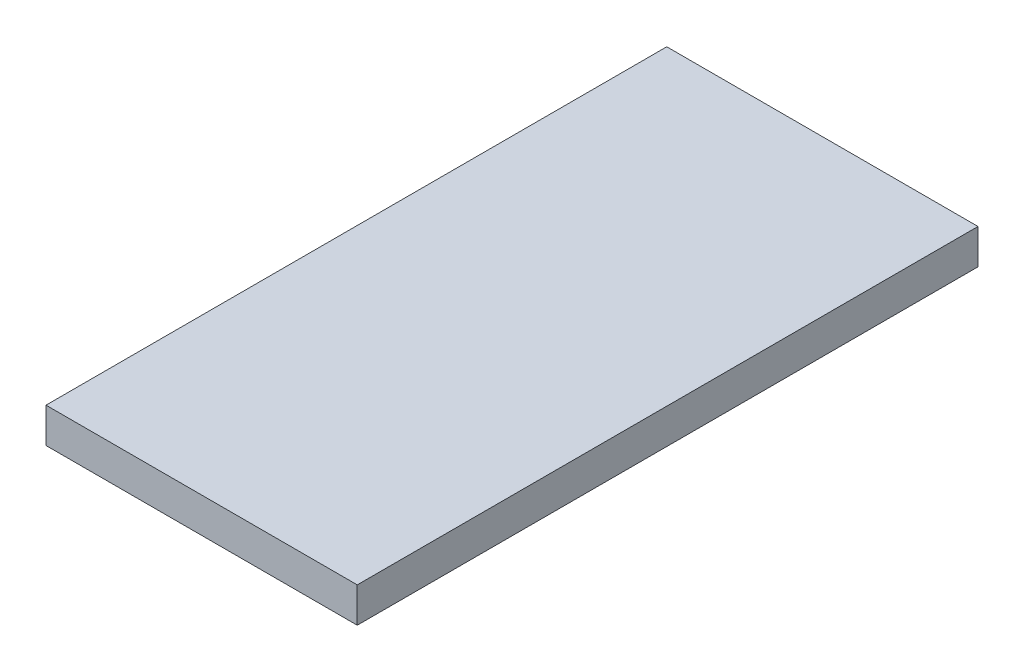
ISO-10303-21;
HEADER;
FILE_DESCRIPTION(('STEP AP214'),'2;1');
FILE_NAME('part.step','',(''),(''),'','','');
FILE_SCHEMA(('AUTOMOTIVE_DESIGN { 1 0 10303 214 1 1 1 1 }'));
ENDSEC;
DATA;
#1=APPLICATION_CONTEXT('core data for automotive mechanical design processes');
#2=APPLICATION_PROTOCOL_DEFINITION('international standard','automotive_design',2000,#1);
#3=PRODUCT_CONTEXT('',#1,'mechanical');
#4=PRODUCT('Part','Part','',(#3));
#5=PRODUCT_RELATED_PRODUCT_CATEGORY('part','',(#4));
#6=PRODUCT_DEFINITION_FORMATION('','',#4);
#7=PRODUCT_DEFINITION_CONTEXT('part definition',#1,'design');
#8=PRODUCT_DEFINITION('design','',#6,#7);
#9=PRODUCT_DEFINITION_SHAPE('','',#8);
#10=(LENGTH_UNIT() NAMED_UNIT(*) SI_UNIT(.MILLI.,.METRE.));
#11=(NAMED_UNIT(*) PLANE_ANGLE_UNIT() SI_UNIT($,.RADIAN.));
#12=(NAMED_UNIT(*) SI_UNIT($,.STERADIAN.) SOLID_ANGLE_UNIT());
#13=UNCERTAINTY_MEASURE_WITH_UNIT(LENGTH_MEASURE(1.E-05),#10,'distance_accuracy_value','');
#14=(GEOMETRIC_REPRESENTATION_CONTEXT(3) GLOBAL_UNCERTAINTY_ASSIGNED_CONTEXT((#13)) GLOBAL_UNIT_ASSIGNED_CONTEXT((#10,
#11,#12)) REPRESENTATION_CONTEXT('',''));
#15=CARTESIAN_POINT('',(0.,0.,0.));
#16=DIRECTION('',(0.,0.,1.));
#17=DIRECTION('',(1.,0.,0.));
#18=AXIS2_PLACEMENT_3D('',#15,#16,#17);
#19=CARTESIAN_POINT('',(8.9,2.,-17.75));
#20=DIRECTION('',(-1.,0.,0.));
#21=DIRECTION('',(0.,0.,1.));
#22=AXIS2_PLACEMENT_3D('',#19,#20,#21);
#23=PLANE('',#22);
#24=DIRECTION('',(0.,0.,-1.));
#25=VECTOR('',#24,1.);
#26=CARTESIAN_POINT('',(8.9,0.,-17.75));
#27=LINE('',#26,#25);
#28=CARTESIAN_POINT('',(8.9,0.,17.75));
#29=VERTEX_POINT('',#28);
#30=CARTESIAN_POINT('',(8.9,0.,-17.75));
#31=VERTEX_POINT('',#30);
#32=EDGE_CURVE('E113',#29,#31,#27,.T.);
#33=ORIENTED_EDGE('',*,*,#32,.T.);
#34=DIRECTION('',(0.,-1.,0.));
#35=VECTOR('',#34,1.);
#36=CARTESIAN_POINT('',(8.9,2.,-17.75));
#37=LINE('',#36,#35);
#38=CARTESIAN_POINT('',(8.9,2.,-17.75));
#39=VERTEX_POINT('',#38);
#40=EDGE_CURVE('E11',#39,#31,#37,.T.);
#41=ORIENTED_EDGE('',*,*,#40,.F.);
#42=DIRECTION('',(0.,0.,-1.));
#43=VECTOR('',#42,1.);
#44=CARTESIAN_POINT('',(8.9,2.,-17.75));
#45=LINE('',#44,#43);
#46=CARTESIAN_POINT('',(8.9,2.,17.75));
#47=VERTEX_POINT('',#46);
#48=EDGE_CURVE('E97',#47,#39,#45,.T.);
#49=ORIENTED_EDGE('',*,*,#48,.F.);
#50=DIRECTION('',(0.,-1.,0.));
#51=VECTOR('',#50,1.);
#52=CARTESIAN_POINT('',(8.9,2.,17.75));
#53=LINE('',#52,#51);
#54=EDGE_CURVE('E109',#47,#29,#53,.T.);
#55=ORIENTED_EDGE('',*,*,#54,.T.);
#56=EDGE_LOOP('',(#33,#41,#49,#55));
#57=FACE_BOUND('',#56,.T.);
#58=ADVANCED_FACE('F45',(#57),#23,.F.);
#59=CARTESIAN_POINT('',(-8.90000000000001,2.,-17.75));
#60=DIRECTION('',(0.,0.,1.));
#61=DIRECTION('',(1.,0.,0.));
#62=AXIS2_PLACEMENT_3D('',#59,#60,#61);
#63=PLANE('',#62);
#64=DIRECTION('',(-1.,0.,0.));
#65=VECTOR('',#64,1.);
#66=CARTESIAN_POINT('',(-8.90000000000001,0.,-17.75));
#67=LINE('',#66,#65);
#68=CARTESIAN_POINT('',(-8.90000000000001,0.,-17.75));
#69=VERTEX_POINT('',#68);
#70=EDGE_CURVE('E102',#31,#69,#67,.T.);
#71=ORIENTED_EDGE('',*,*,#70,.T.);
#72=DIRECTION('',(0.,-1.,0.));
#73=VECTOR('',#72,1.);
#74=CARTESIAN_POINT('',(-8.90000000000001,2.,-17.75));
#75=LINE('',#74,#73);
#76=CARTESIAN_POINT('',(-8.90000000000001,2.,-17.75));
#77=VERTEX_POINT('',#76);
#78=EDGE_CURVE('E54',#77,#69,#75,.T.);
#79=ORIENTED_EDGE('',*,*,#78,.F.);
#80=DIRECTION('',(-1.,0.,0.));
#81=VECTOR('',#80,1.);
#82=CARTESIAN_POINT('',(-8.90000000000001,2.,-17.75));
#83=LINE('',#82,#81);
#84=EDGE_CURVE('E92',#39,#77,#83,.T.);
#85=ORIENTED_EDGE('',*,*,#84,.F.);
#86=ORIENTED_EDGE('',*,*,#40,.T.);
#87=EDGE_LOOP('',(#71,#79,#85,#86));
#88=FACE_BOUND('',#87,.T.);
#89=ADVANCED_FACE('F101',(#88),#63,.F.);
#90=CARTESIAN_POINT('',(-8.90000000000001,2.,-17.75));
#91=DIRECTION('',(1.,0.,0.));
#92=DIRECTION('',(0.,0.,-1.));
#93=AXIS2_PLACEMENT_3D('',#90,#91,#92);
#94=PLANE('',#93);
#95=DIRECTION('',(0.,0.,1.));
#96=VECTOR('',#95,1.);
#97=CARTESIAN_POINT('',(-8.90000000000001,0.,-17.75));
#98=LINE('',#97,#96);
#99=CARTESIAN_POINT('',(-8.9,0.,17.75));
#100=VERTEX_POINT('',#99);
#101=EDGE_CURVE('E79',#69,#100,#98,.T.);
#102=ORIENTED_EDGE('',*,*,#101,.T.);
#103=DIRECTION('',(0.,-1.,0.));
#104=VECTOR('',#103,1.);
#105=CARTESIAN_POINT('',(-8.9,2.,17.75));
#106=LINE('',#105,#104);
#107=CARTESIAN_POINT('',(-8.9,2.,17.75));
#108=VERTEX_POINT('',#107);
#109=EDGE_CURVE('E104',#108,#100,#106,.T.);
#110=ORIENTED_EDGE('',*,*,#109,.F.);
#111=DIRECTION('',(0.,0.,1.));
#112=VECTOR('',#111,1.);
#113=CARTESIAN_POINT('',(-8.90000000000001,2.,-17.75));
#114=LINE('',#113,#112);
#115=EDGE_CURVE('E95',#77,#108,#114,.T.);
#116=ORIENTED_EDGE('',*,*,#115,.F.);
#117=ORIENTED_EDGE('',*,*,#78,.T.);
#118=EDGE_LOOP('',(#102,#110,#116,#117));
#119=FACE_BOUND('',#118,.T.);
#120=ADVANCED_FACE('F105',(#119),#94,.F.);
#121=CARTESIAN_POINT('',(-8.9,2.,17.75));
#122=DIRECTION('',(0.,0.,-1.));
#123=DIRECTION('',(-1.,0.,0.));
#124=AXIS2_PLACEMENT_3D('',#121,#122,#123);
#125=PLANE('',#124);
#126=DIRECTION('',(1.,0.,0.));
#127=VECTOR('',#126,1.);
#128=CARTESIAN_POINT('',(-8.9,0.,17.75));
#129=LINE('',#128,#127);
#130=EDGE_CURVE('E85',#100,#29,#129,.T.);
#131=ORIENTED_EDGE('',*,*,#130,.T.);
#132=ORIENTED_EDGE('',*,*,#54,.F.);
#133=DIRECTION('',(1.,0.,0.));
#134=VECTOR('',#133,1.);
#135=CARTESIAN_POINT('',(-8.9,2.,17.75));
#136=LINE('',#135,#134);
#137=EDGE_CURVE('E62',#108,#47,#136,.T.);
#138=ORIENTED_EDGE('',*,*,#137,.F.);
#139=ORIENTED_EDGE('',*,*,#109,.T.);
#140=EDGE_LOOP('',(#131,#132,#138,#139));
#141=FACE_BOUND('',#140,.T.);
#142=ADVANCED_FACE('F126',(#141),#125,.F.);
#143=CARTESIAN_POINT('',(0.,2.,0.));
#144=DIRECTION('',(0.,1.,0.));
#145=DIRECTION('',(0.,0.,1.));
#146=AXIS2_PLACEMENT_3D('',#143,#144,#145);
#147=PLANE('',#146);
#148=ORIENTED_EDGE('',*,*,#48,.T.);
#149=ORIENTED_EDGE('',*,*,#84,.T.);
#150=ORIENTED_EDGE('',*,*,#115,.T.);
#151=ORIENTED_EDGE('',*,*,#137,.T.);
#152=EDGE_LOOP('',(#148,#149,#150,#151));
#153=FACE_BOUND('',#152,.T.);
#154=ADVANCED_FACE('F93',(#153),#147,.T.);
#155=CARTESIAN_POINT('',(0.,0.,0.));
#156=DIRECTION('',(0.,1.,0.));
#157=DIRECTION('',(0.,0.,1.));
#158=AXIS2_PLACEMENT_3D('',#155,#156,#157);
#159=PLANE('',#158);
#160=ORIENTED_EDGE('',*,*,#32,.F.);
#161=ORIENTED_EDGE('',*,*,#130,.F.);
#162=ORIENTED_EDGE('',*,*,#101,.F.);
#163=ORIENTED_EDGE('',*,*,#70,.F.);
#164=EDGE_LOOP('',(#160,#161,#162,#163));
#165=FACE_BOUND('',#164,.T.);
#166=ADVANCED_FACE('F129',(#165),#159,.F.);
#167=CLOSED_SHELL('',(#58,#89,#120,#142,#154,#166));
#168=MANIFOLD_SOLID_BREP('B2',#167);
#169=ADVANCED_BREP_SHAPE_REPRESENTATION('',(#18,#168),#14);
#170=SHAPE_DEFINITION_REPRESENTATION(#9,#169);
ENDSEC;
END-ISO-10303-21;
